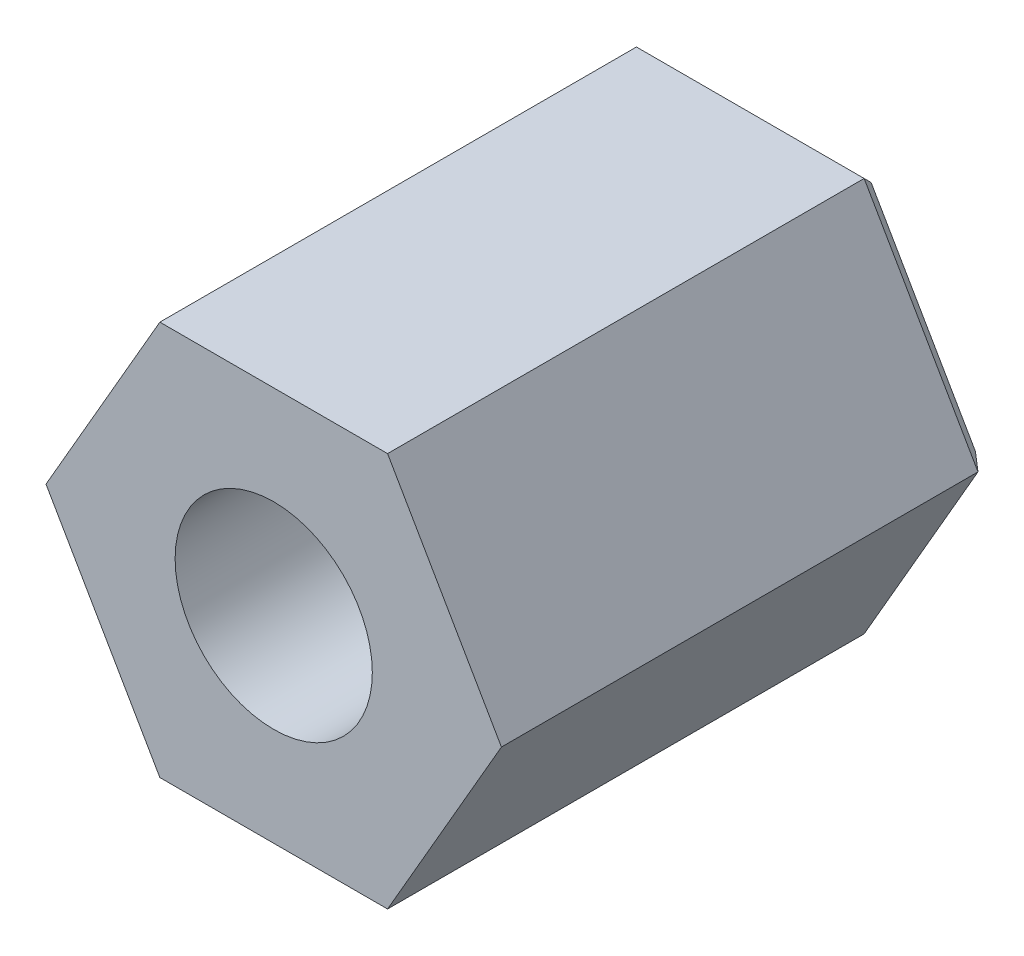
ISO-10303-21;
HEADER;
FILE_DESCRIPTION(('STEP AP214'),'2;1');
FILE_NAME('part.step','',(''),(''),'','','');
FILE_SCHEMA(('AUTOMOTIVE_DESIGN { 1 0 10303 214 1 1 1 1 }'));
ENDSEC;
DATA;
#1=APPLICATION_CONTEXT('core data for automotive mechanical design processes');
#2=APPLICATION_PROTOCOL_DEFINITION('international standard','automotive_design',2000,#1);
#3=PRODUCT_CONTEXT('',#1,'mechanical');
#4=PRODUCT('Part','Part','',(#3));
#5=PRODUCT_RELATED_PRODUCT_CATEGORY('part','',(#4));
#6=PRODUCT_DEFINITION_FORMATION('','',#4);
#7=PRODUCT_DEFINITION_CONTEXT('part definition',#1,'design');
#8=PRODUCT_DEFINITION('design','',#6,#7);
#9=PRODUCT_DEFINITION_SHAPE('','',#8);
#10=(LENGTH_UNIT() NAMED_UNIT(*) SI_UNIT(.MILLI.,.METRE.));
#11=(NAMED_UNIT(*) PLANE_ANGLE_UNIT() SI_UNIT($,.RADIAN.));
#12=(NAMED_UNIT(*) SI_UNIT($,.STERADIAN.) SOLID_ANGLE_UNIT());
#13=UNCERTAINTY_MEASURE_WITH_UNIT(LENGTH_MEASURE(1.E-05),#10,'distance_accuracy_value','');
#14=(GEOMETRIC_REPRESENTATION_CONTEXT(3) GLOBAL_UNCERTAINTY_ASSIGNED_CONTEXT((#13)) GLOBAL_UNIT_ASSIGNED_CONTEXT((#10,
#11,#12)) REPRESENTATION_CONTEXT('',''));
#15=CARTESIAN_POINT('',(0.,0.,0.));
#16=DIRECTION('',(0.,0.,1.));
#17=DIRECTION('',(1.,0.,0.));
#18=AXIS2_PLACEMENT_3D('',#15,#16,#17);
#19=CARTESIAN_POINT('',(3.46410161513775,-6.00000000000001,0.));
#20=DIRECTION('',(0.,0.,-1.));
#21=DIRECTION('',(-1.,0.,0.));
#22=AXIS2_PLACEMENT_3D('',#19,#20,#21);
#23=PLANE('',#22);
#24=CARTESIAN_POINT('',(0.,0.,0.));
#25=DIRECTION('',(0.,0.,-1.));
#26=DIRECTION('',(-1.,0.,0.));
#27=AXIS2_PLACEMENT_3D('',#24,#25,#26);
#28=CIRCLE('',#27,2.49999999999773);
#29=CARTESIAN_POINT('',(-2.49999999999773,0.,0.));
#30=VERTEX_POINT('',#29);
#31=EDGE_CURVE('E19',#30,#30,#28,.F.);
#32=ORIENTED_EDGE('',*,*,#31,.T.);
#33=EDGE_LOOP('',(#32));
#34=FACE_BOUND('',#33,.T.);
#35=DIRECTION('',(0.5,-0.866025403784439,0.));
#36=VECTOR('',#35,1.);
#37=CARTESIAN_POINT('',(-6.3508529610859,0.,0.));
#38=LINE('',#37,#36);
#39=CARTESIAN_POINT('',(-6.3508529610859,0.,0.));
#40=VERTEX_POINT('',#39);
#41=CARTESIAN_POINT('',(-3.17542648054295,-5.50000000000001,0.));
#42=VERTEX_POINT('',#41);
#43=EDGE_CURVE('E85',#40,#42,#38,.T.);
#44=ORIENTED_EDGE('',*,*,#43,.F.);
#45=DIRECTION('',(-0.5,-0.866025403784439,0.));
#46=VECTOR('',#45,1.);
#47=CARTESIAN_POINT('',(-3.17542648054295,5.50000000000001,0.));
#48=LINE('',#47,#46);
#49=CARTESIAN_POINT('',(-3.17542648054295,5.50000000000001,0.));
#50=VERTEX_POINT('',#49);
#51=EDGE_CURVE('E108',#50,#40,#48,.T.);
#52=ORIENTED_EDGE('',*,*,#51,.F.);
#53=DIRECTION('',(1.,0.,0.));
#54=VECTOR('',#53,1.);
#55=CARTESIAN_POINT('',(3.46410161513775,5.50000000000001,0.));
#56=LINE('',#55,#54);
#57=CARTESIAN_POINT('',(3.17542648054293,5.50000000000001,0.));
#58=VERTEX_POINT('',#57);
#59=EDGE_CURVE('E176',#58,#50,#56,.F.);
#60=ORIENTED_EDGE('',*,*,#59,.F.);
#61=DIRECTION('',(-0.5,0.866025403784438,0.));
#62=VECTOR('',#61,1.);
#63=CARTESIAN_POINT('',(6.35085296108588,0.,0.));
#64=LINE('',#63,#62);
#65=CARTESIAN_POINT('',(6.35085296108588,0.,0.));
#66=VERTEX_POINT('',#65);
#67=EDGE_CURVE('E174',#66,#58,#64,.T.);
#68=ORIENTED_EDGE('',*,*,#67,.F.);
#69=DIRECTION('',(0.5,0.866025403784439,0.));
#70=VECTOR('',#69,1.);
#71=CARTESIAN_POINT('',(3.17542648054294,-5.50000000000001,0.));
#72=LINE('',#71,#70);
#73=CARTESIAN_POINT('',(3.17542648054294,-5.50000000000001,0.));
#74=VERTEX_POINT('',#73);
#75=EDGE_CURVE('E99',#74,#66,#72,.T.);
#76=ORIENTED_EDGE('',*,*,#75,.F.);
#77=DIRECTION('',(1.,0.,0.));
#78=VECTOR('',#77,1.);
#79=CARTESIAN_POINT('',(-3.46410161513776,-5.50000000000001,0.));
#80=LINE('',#79,#78);
#81=EDGE_CURVE('E95',#42,#74,#80,.T.);
#82=ORIENTED_EDGE('',*,*,#81,.F.);
#83=EDGE_LOOP('',(#44,#52,#60,#68,#76,#82));
#84=FACE_BOUND('',#83,.T.);
#85=ADVANCED_FACE('F16',(#34,#84),#23,.T.);
#86=CARTESIAN_POINT('',(-3.46410161513776,-6.00000000000001,0.5));
#87=DIRECTION('',(0.,-0.707106781186546,-0.707106781186549));
#88=DIRECTION('',(0.,0.707106781186549,-0.707106781186546));
#89=AXIS2_PLACEMENT_3D('',#86,#87,#88);
#90=PLANE('',#89);
#91=DIRECTION('',(-0.377964473009228,0.654653670707978,-0.654653670707976));
#92=VECTOR('',#91,1.);
#93=CARTESIAN_POINT('',(3.46410161513775,-6.00000000000001,0.5));
#94=LINE('',#93,#92);
#95=CARTESIAN_POINT('',(3.46410161513775,-6.00000000000001,0.499999999999999));
#96=VERTEX_POINT('',#95);
#97=EDGE_CURVE('E170',#96,#74,#94,.T.);
#98=ORIENTED_EDGE('',*,*,#97,.F.);
#99=DIRECTION('',(-1.,0.,0.));
#100=VECTOR('',#99,1.);
#101=CARTESIAN_POINT('',(-3.46410161513776,-6.00000000000001,0.5));
#102=LINE('',#101,#100);
#103=CARTESIAN_POINT('',(-3.46410161513776,-6.00000000000001,0.500000000000001));
#104=VERTEX_POINT('',#103);
#105=EDGE_CURVE('E105',#96,#104,#102,.T.);
#106=ORIENTED_EDGE('',*,*,#105,.T.);
#107=DIRECTION('',(-0.377964473009228,-0.654653670707978,0.654653670707976));
#108=VECTOR('',#107,1.);
#109=CARTESIAN_POINT('',(-3.17542648054295,-5.50000000000001,0.));
#110=LINE('',#109,#108);
#111=EDGE_CURVE('E92',#42,#104,#110,.T.);
#112=ORIENTED_EDGE('',*,*,#111,.F.);
#113=ORIENTED_EDGE('',*,*,#81,.T.);
#114=EDGE_LOOP('',(#98,#106,#112,#113));
#115=FACE_BOUND('',#114,.T.);
#116=ADVANCED_FACE('F104',(#115),#90,.T.);
#117=CARTESIAN_POINT('',(-6.92820323027552,0.,0.5));
#118=DIRECTION('',(-0.612372435695793,-0.353553390593273,-0.707106781186549));
#119=DIRECTION('',(-0.755928946018456,0.,0.654653670707976));
#120=AXIS2_PLACEMENT_3D('',#117,#118,#119);
#121=PLANE('',#120);
#122=ORIENTED_EDGE('',*,*,#111,.T.);
#123=DIRECTION('',(-0.5,0.866025403784439,0.));
#124=VECTOR('',#123,1.);
#125=CARTESIAN_POINT('',(-6.92820323027552,0.,0.5));
#126=LINE('',#125,#124);
#127=CARTESIAN_POINT('',(-6.92820323027552,0.,0.5));
#128=VERTEX_POINT('',#127);
#129=EDGE_CURVE('E222',#104,#128,#126,.T.);
#130=ORIENTED_EDGE('',*,*,#129,.T.);
#131=DIRECTION('',(-0.755928946018456,0.,0.654653670707976));
#132=VECTOR('',#131,1.);
#133=CARTESIAN_POINT('',(-4.94871659305394,0.,-1.21428571428572));
#134=LINE('',#133,#132);
#135=EDGE_CURVE('E94',#40,#128,#134,.T.);
#136=ORIENTED_EDGE('',*,*,#135,.F.);
#137=ORIENTED_EDGE('',*,*,#43,.T.);
#138=EDGE_LOOP('',(#122,#130,#136,#137));
#139=FACE_BOUND('',#138,.T.);
#140=ADVANCED_FACE('F89',(#139),#121,.T.);
#141=CARTESIAN_POINT('',(-3.46410161513776,6.00000000000001,0.5));
#142=DIRECTION('',(-0.612372435695794,0.353553390593273,-0.707106781186549));
#143=DIRECTION('',(-0.755928946018456,0.,0.654653670707976));
#144=AXIS2_PLACEMENT_3D('',#141,#142,#143);
#145=PLANE('',#144);
#146=DIRECTION('',(-0.377964473009227,0.654653670707979,0.654653670707975));
#147=VECTOR('',#146,1.);
#148=CARTESIAN_POINT('',(-3.17542648054295,5.50000000000001,0.));
#149=LINE('',#148,#147);
#150=CARTESIAN_POINT('',(-3.46410161513776,6.00000000000001,0.499999999999998));
#151=VERTEX_POINT('',#150);
#152=EDGE_CURVE('E179',#50,#151,#149,.T.);
#153=ORIENTED_EDGE('',*,*,#152,.F.);
#154=ORIENTED_EDGE('',*,*,#51,.T.);
#155=ORIENTED_EDGE('',*,*,#135,.T.);
#156=DIRECTION('',(0.5,0.866025403784439,0.));
#157=VECTOR('',#156,1.);
#158=CARTESIAN_POINT('',(-3.46410161513776,6.00000000000001,0.499999999999994));
#159=LINE('',#158,#157);
#160=EDGE_CURVE('E217',#128,#151,#159,.T.);
#161=ORIENTED_EDGE('',*,*,#160,.T.);
#162=EDGE_LOOP('',(#153,#154,#155,#161));
#163=FACE_BOUND('',#162,.T.);
#164=ADVANCED_FACE('F182',(#163),#145,.T.);
#165=CARTESIAN_POINT('',(3.46410161513775,6.00000000000001,0.5));
#166=DIRECTION('',(0.,0.707106781186546,-0.707106781186549));
#167=DIRECTION('',(0.,0.707106781186549,0.707106781186546));
#168=AXIS2_PLACEMENT_3D('',#165,#166,#167);
#169=PLANE('',#168);
#170=DIRECTION('',(0.377964473009225,0.65465367070798,0.654653670707976));
#171=VECTOR('',#170,1.);
#172=CARTESIAN_POINT('',(3.17542648054293,5.50000000000001,0.));
#173=LINE('',#172,#171);
#174=CARTESIAN_POINT('',(3.46410161513775,6.00000000000001,0.5));
#175=VERTEX_POINT('',#174);
#176=EDGE_CURVE('E172',#58,#175,#173,.T.);
#177=ORIENTED_EDGE('',*,*,#176,.F.);
#178=ORIENTED_EDGE('',*,*,#59,.T.);
#179=ORIENTED_EDGE('',*,*,#152,.T.);
#180=DIRECTION('',(1.,0.,0.));
#181=VECTOR('',#180,1.);
#182=CARTESIAN_POINT('',(3.46410161513775,6.00000000000001,0.5));
#183=LINE('',#182,#181);
#184=EDGE_CURVE('E190',#151,#175,#183,.T.);
#185=ORIENTED_EDGE('',*,*,#184,.T.);
#186=EDGE_LOOP('',(#177,#178,#179,#185));
#187=FACE_BOUND('',#186,.T.);
#188=ADVANCED_FACE('F187',(#187),#169,.T.);
#189=CARTESIAN_POINT('',(6.92820323027551,0.,0.5));
#190=DIRECTION('',(0.612372435695794,0.353553390593274,-0.707106781186548));
#191=DIRECTION('',(-0.755928946018455,0.,-0.654653670707976));
#192=AXIS2_PLACEMENT_3D('',#189,#190,#191);
#193=PLANE('',#192);
#194=ORIENTED_EDGE('',*,*,#176,.T.);
#195=DIRECTION('',(0.5,-0.866025403784438,0.));
#196=VECTOR('',#195,1.);
#197=CARTESIAN_POINT('',(6.92820323027551,0.,0.5));
#198=LINE('',#197,#196);
#199=CARTESIAN_POINT('',(6.92820323027551,0.,0.5));
#200=VERTEX_POINT('',#199);
#201=EDGE_CURVE('E196',#175,#200,#198,.T.);
#202=ORIENTED_EDGE('',*,*,#201,.T.);
#203=DIRECTION('',(-0.755928946018456,0.,-0.654653670707976));
#204=VECTOR('',#203,1.);
#205=CARTESIAN_POINT('',(4.94871659305393,0.,-1.21428571428572));
#206=LINE('',#205,#204);
#207=EDGE_CURVE('E167',#66,#200,#206,.F.);
#208=ORIENTED_EDGE('',*,*,#207,.F.);
#209=ORIENTED_EDGE('',*,*,#67,.T.);
#210=EDGE_LOOP('',(#194,#202,#208,#209));
#211=FACE_BOUND('',#210,.T.);
#212=ADVANCED_FACE('F194',(#211),#193,.T.);
#213=CARTESIAN_POINT('',(3.46410161513775,-6.00000000000001,0.5));
#214=DIRECTION('',(0.612372435695793,-0.353553390593273,-0.707106781186549));
#215=DIRECTION('',(-0.755928946018456,0.,-0.654653670707976));
#216=AXIS2_PLACEMENT_3D('',#213,#214,#215);
#217=PLANE('',#216);
#218=ORIENTED_EDGE('',*,*,#207,.T.);
#219=DIRECTION('',(-0.5,-0.866025403784439,0.));
#220=VECTOR('',#219,1.);
#221=CARTESIAN_POINT('',(3.46410161513775,-6.00000000000001,0.499999999999994));
#222=LINE('',#221,#220);
#223=EDGE_CURVE('E200',#200,#96,#222,.T.);
#224=ORIENTED_EDGE('',*,*,#223,.T.);
#225=ORIENTED_EDGE('',*,*,#97,.T.);
#226=ORIENTED_EDGE('',*,*,#75,.T.);
#227=EDGE_LOOP('',(#218,#224,#225,#226));
#228=FACE_BOUND('',#227,.T.);
#229=ADVANCED_FACE('F199',(#228),#217,.T.);
#230=CARTESIAN_POINT('',(0.,0.,0.));
#231=DIRECTION('',(0.,0.,-1.));
#232=DIRECTION('',(-1.,0.,0.));
#233=AXIS2_PLACEMENT_3D('',#230,#231,#232);
#234=CONICAL_SURFACE('',#233,2.49999999999773,0.785398163454292);
#235=CARTESIAN_POINT('',(0.,0.,0.500000000000006));
#236=DIRECTION('',(0.,0.,-1.));
#237=DIRECTION('',(-1.,0.,0.));
#238=AXIS2_PLACEMENT_3D('',#235,#236,#237);
#239=CIRCLE('',#238,2.);
#240=CARTESIAN_POINT('',(-2.,0.,0.500000000000006));
#241=VERTEX_POINT('',#240);
#242=EDGE_CURVE('E155',#241,#241,#239,.F.);
#243=ORIENTED_EDGE('',*,*,#242,.T.);
#244=EDGE_LOOP('',(#243));
#245=FACE_BOUND('',#244,.T.);
#246=ORIENTED_EDGE('',*,*,#31,.F.);
#247=EDGE_LOOP('',(#246));
#248=FACE_BOUND('',#247,.T.);
#249=ADVANCED_FACE('F229',(#245,#248),#234,.F.);
#250=CARTESIAN_POINT('',(-3.46410161513776,-6.00000000000001,15.));
#251=DIRECTION('',(0.,1.,0.));
#252=DIRECTION('',(-1.,0.,0.));
#253=AXIS2_PLACEMENT_3D('',#250,#251,#252);
#254=PLANE('',#253);
#255=ORIENTED_EDGE('',*,*,#105,.F.);
#256=DIRECTION('',(0.,0.,1.));
#257=VECTOR('',#256,1.);
#258=CARTESIAN_POINT('',(3.46410161513775,-6.00000000000001,15.));
#259=LINE('',#258,#257);
#260=CARTESIAN_POINT('',(3.46410161513775,-6.00000000000001,15.));
#261=VERTEX_POINT('',#260);
#262=EDGE_CURVE('E163',#96,#261,#259,.T.);
#263=ORIENTED_EDGE('',*,*,#262,.T.);
#264=DIRECTION('',(-1.,0.,0.));
#265=VECTOR('',#264,1.);
#266=CARTESIAN_POINT('',(3.46410161513775,-6.00000000000001,15.));
#267=LINE('',#266,#265);
#268=CARTESIAN_POINT('',(-3.46410161513776,-6.00000000000001,15.));
#269=VERTEX_POINT('',#268);
#270=EDGE_CURVE('E157',#261,#269,#267,.T.);
#271=ORIENTED_EDGE('',*,*,#270,.T.);
#272=DIRECTION('',(0.,0.,1.));
#273=VECTOR('',#272,1.);
#274=CARTESIAN_POINT('',(-3.46410161513776,-6.00000000000001,15.));
#275=LINE('',#274,#273);
#276=EDGE_CURVE('E223',#269,#104,#275,.F.);
#277=ORIENTED_EDGE('',*,*,#276,.T.);
#278=EDGE_LOOP('',(#255,#263,#271,#277));
#279=FACE_BOUND('',#278,.T.);
#280=ADVANCED_FACE('F231',(#279),#254,.F.);
#281=CARTESIAN_POINT('',(-6.92820323027552,0.,15.));
#282=DIRECTION('',(0.866025403784439,0.5,0.));
#283=DIRECTION('',(-0.5,0.866025403784439,0.));
#284=AXIS2_PLACEMENT_3D('',#281,#282,#283);
#285=PLANE('',#284);
#286=ORIENTED_EDGE('',*,*,#129,.F.);
#287=ORIENTED_EDGE('',*,*,#276,.F.);
#288=DIRECTION('',(-0.5,0.866025403784439,0.));
#289=VECTOR('',#288,1.);
#290=CARTESIAN_POINT('',(-3.46410161513776,-6.00000000000001,15.));
#291=LINE('',#290,#289);
#292=CARTESIAN_POINT('',(-6.92820323027552,0.,15.));
#293=VERTEX_POINT('',#292);
#294=EDGE_CURVE('E160',#269,#293,#291,.T.);
#295=ORIENTED_EDGE('',*,*,#294,.T.);
#296=DIRECTION('',(0.,0.,1.));
#297=VECTOR('',#296,1.);
#298=CARTESIAN_POINT('',(-6.92820323027552,0.,15.));
#299=LINE('',#298,#297);
#300=EDGE_CURVE('E219',#293,#128,#299,.F.);
#301=ORIENTED_EDGE('',*,*,#300,.T.);
#302=EDGE_LOOP('',(#286,#287,#295,#301));
#303=FACE_BOUND('',#302,.T.);
#304=ADVANCED_FACE('F237',(#303),#285,.F.);
#305=CARTESIAN_POINT('',(-3.46410161513776,6.00000000000001,15.));
#306=DIRECTION('',(0.866025403784439,-0.5,0.));
#307=DIRECTION('',(0.5,0.866025403784439,0.));
#308=AXIS2_PLACEMENT_3D('',#305,#306,#307);
#309=PLANE('',#308);
#310=ORIENTED_EDGE('',*,*,#160,.F.);
#311=ORIENTED_EDGE('',*,*,#300,.F.);
#312=DIRECTION('',(0.5,0.866025403784439,0.));
#313=VECTOR('',#312,1.);
#314=CARTESIAN_POINT('',(-6.92820323027552,0.,15.));
#315=LINE('',#314,#313);
#316=CARTESIAN_POINT('',(-3.46410161513776,6.00000000000001,15.));
#317=VERTEX_POINT('',#316);
#318=EDGE_CURVE('E396',#293,#317,#315,.T.);
#319=ORIENTED_EDGE('',*,*,#318,.T.);
#320=DIRECTION('',(0.,0.,-1.));
#321=VECTOR('',#320,1.);
#322=CARTESIAN_POINT('',(-3.46410161513776,6.00000000000001,15.));
#323=LINE('',#322,#321);
#324=EDGE_CURVE('E214',#317,#151,#323,.T.);
#325=ORIENTED_EDGE('',*,*,#324,.T.);
#326=EDGE_LOOP('',(#310,#311,#319,#325));
#327=FACE_BOUND('',#326,.T.);
#328=CARTESIAN_POINT('',(-5.19615242270665,3.00000000000001,6.));
#329=DIRECTION('',(-0.866025403784439,0.5,0.));
#330=DIRECTION('',(-0.5,-0.866025403784439,0.));
#331=AXIS2_PLACEMENT_3D('',#328,#329,#330);
#332=CIRCLE('',#331,1.5);
#333=CARTESIAN_POINT('',(-5.94615242270665,1.70096189432335,6.));
#334=VERTEX_POINT('',#333);
#335=EDGE_CURVE('E125',#334,#334,#332,.F.);
#336=ORIENTED_EDGE('',*,*,#335,.T.);
#337=EDGE_LOOP('',(#336));
#338=FACE_BOUND('',#337,.T.);
#339=ADVANCED_FACE('F318',(#327,#338),#309,.F.);
#340=CARTESIAN_POINT('',(3.46410161513775,6.00000000000001,15.));
#341=DIRECTION('',(0.,-1.,0.));
#342=DIRECTION('',(0.,0.,-1.));
#343=AXIS2_PLACEMENT_3D('',#340,#341,#342);
#344=PLANE('',#343);
#345=ORIENTED_EDGE('',*,*,#184,.F.);
#346=ORIENTED_EDGE('',*,*,#324,.F.);
#347=DIRECTION('',(-1.,0.,0.));
#348=VECTOR('',#347,1.);
#349=CARTESIAN_POINT('',(3.46410161513775,6.00000000000002,15.));
#350=LINE('',#349,#348);
#351=CARTESIAN_POINT('',(3.46410161513775,6.00000000000001,15.));
#352=VERTEX_POINT('',#351);
#353=EDGE_CURVE('E392',#317,#352,#350,.F.);
#354=ORIENTED_EDGE('',*,*,#353,.T.);
#355=DIRECTION('',(0.,0.,1.));
#356=VECTOR('',#355,1.);
#357=CARTESIAN_POINT('',(3.46410161513774,6.00000000000001,15.));
#358=LINE('',#357,#356);
#359=EDGE_CURVE('E210',#352,#175,#358,.F.);
#360=ORIENTED_EDGE('',*,*,#359,.T.);
#361=EDGE_LOOP('',(#345,#346,#354,#360));
#362=FACE_BOUND('',#361,.T.);
#363=ADVANCED_FACE('F327',(#362),#344,.F.);
#364=CARTESIAN_POINT('',(6.92820323027551,0.,15.));
#365=DIRECTION('',(-0.866025403784438,-0.5,0.));
#366=DIRECTION('',(0.5,-0.866025403784438,0.));
#367=AXIS2_PLACEMENT_3D('',#364,#365,#366);
#368=PLANE('',#367);
#369=ORIENTED_EDGE('',*,*,#201,.F.);
#370=ORIENTED_EDGE('',*,*,#359,.F.);
#371=DIRECTION('',(0.5,-0.866025403784438,0.));
#372=VECTOR('',#371,1.);
#373=CARTESIAN_POINT('',(3.46410161513775,6.00000000000002,15.));
#374=LINE('',#373,#372);
#375=CARTESIAN_POINT('',(6.92820323027551,0.,15.));
#376=VERTEX_POINT('',#375);
#377=EDGE_CURVE('E395',#352,#376,#374,.T.);
#378=ORIENTED_EDGE('',*,*,#377,.T.);
#379=DIRECTION('',(0.,0.,1.));
#380=VECTOR('',#379,1.);
#381=CARTESIAN_POINT('',(6.92820323027551,0.,15.));
#382=LINE('',#381,#380);
#383=EDGE_CURVE('E34',#376,#200,#382,.F.);
#384=ORIENTED_EDGE('',*,*,#383,.T.);
#385=EDGE_LOOP('',(#369,#370,#378,#384));
#386=FACE_BOUND('',#385,.T.);
#387=ADVANCED_FACE('F337',(#386),#368,.F.);
#388=CARTESIAN_POINT('',(3.46410161513775,-6.00000000000001,15.));
#389=DIRECTION('',(-0.866025403784439,0.5,0.));
#390=DIRECTION('',(-0.5,-0.866025403784439,0.));
#391=AXIS2_PLACEMENT_3D('',#388,#389,#390);
#392=PLANE('',#391);
#393=ORIENTED_EDGE('',*,*,#223,.F.);
#394=ORIENTED_EDGE('',*,*,#383,.F.);
#395=DIRECTION('',(-0.5,-0.866025403784439,0.));
#396=VECTOR('',#395,1.);
#397=CARTESIAN_POINT('',(6.92820323027551,0.,15.));
#398=LINE('',#397,#396);
#399=EDGE_CURVE('E124',#376,#261,#398,.T.);
#400=ORIENTED_EDGE('',*,*,#399,.T.);
#401=ORIENTED_EDGE('',*,*,#262,.F.);
#402=EDGE_LOOP('',(#393,#394,#400,#401));
#403=FACE_BOUND('',#402,.T.);
#404=ADVANCED_FACE('F149',(#403),#392,.F.);
#405=CARTESIAN_POINT('',(0.,0.,6.));
#406=DIRECTION('',(-0.866025403784439,0.5,0.));
#407=DIRECTION('',(-0.5,-0.866025403784439,0.));
#408=AXIS2_PLACEMENT_3D('',#405,#406,#407);
#409=CYLINDRICAL_SURFACE('',#408,1.5);
#410=CARTESIAN_POINT('',(-1.5,2.59807621135332,6.));
#411=CARTESIAN_POINT('',(-1.50000736907311,2.59807516061262,6.07822593596948));
#412=CARTESIAN_POINT('',(-1.50618117762352,2.59453752020173,6.15649796806455));
#413=CARTESIAN_POINT('',(-1.53025693029932,2.5804063043293,6.31059829635993));
#414=CARTESIAN_POINT('',(-1.54817341464831,2.56980398083941,6.38642344043881));
#415=CARTESIAN_POINT('',(-1.59396418125756,2.54165094120173,6.53317276451657));
#416=CARTESIAN_POINT('',(-1.62178889130733,2.52413476950191,6.6041192817077));
#417=CARTESIAN_POINT('',(-1.68536551686751,2.48213427329621,6.74012356610808));
#418=CARTESIAN_POINT('',(-1.72111933792512,2.45764827337906,6.80517991247268));
#419=CARTESIAN_POINT('',(-1.80169027265116,2.39928771834709,6.93345994880613));
#420=CARTESIAN_POINT('',(-1.84701142929048,2.364805821408,6.99609096029848));
#421=CARTESIAN_POINT('',(-1.94208523524274,2.28737070892969,7.11211441557761));
#422=CARTESIAN_POINT('',(-1.99183992211687,2.24441358722209,7.16550257802119));
#423=CARTESIAN_POINT('',(-2.096859127732,2.14677769428467,7.26505066046027));
#424=CARTESIAN_POINT('',(-2.15226895631906,2.09150388317091,7.31048051552693));
#425=CARTESIAN_POINT('',(-2.26255320420145,1.9716654849211,7.38771117846174));
#426=CARTESIAN_POINT('',(-2.3174279385169,1.90710676697032,7.41952054598338));
#427=CARTESIAN_POINT('',(-2.4199991843152,1.77485225872997,7.466256954714));
#428=CARTESIAN_POINT('',(-2.46792862807209,1.70770657958125,7.48222423578925));
#429=CARTESIAN_POINT('',(-2.55874661019408,1.56834837527528,7.50024917016289));
#430=CARTESIAN_POINT('',(-2.60163816625428,1.4961389251476,7.50231519249675));
#431=CARTESIAN_POINT('',(-2.67737171844855,1.35554560174412,7.49287998146216));
#432=CARTESIAN_POINT('',(-2.71076327798687,1.28737511190643,7.48254294046451));
#433=CARTESIAN_POINT('',(-2.77144247133596,1.15094810757322,7.45067864865459));
#434=CARTESIAN_POINT('',(-2.79872967143314,1.0826915873115,7.42915060308451));
#435=CARTESIAN_POINT('',(-2.84747778051418,0.947171104150869,7.37537594891822));
#436=CARTESIAN_POINT('',(-2.86885279130447,0.879933968063741,7.34298506428883));
#437=CARTESIAN_POINT('',(-2.90571831733054,0.749277042478965,7.26860415810876));
#438=CARTESIAN_POINT('',(-2.92120681414999,0.685858568617126,7.22661085189166));
#439=CARTESIAN_POINT('',(-2.94828961634389,0.558748132651434,7.1296616750453));
#440=CARTESIAN_POINT('',(-2.95937802130257,0.495595953181213,7.07385616010151));
#441=CARTESIAN_POINT('',(-2.97670939502514,0.377826166623014,6.9531262090634));
#442=CARTESIAN_POINT('',(-2.98294778246146,0.323216667744126,6.88819321933783));
#443=CARTESIAN_POINT('',(-2.99227281060953,0.221530094753806,6.74598787458372));
#444=CARTESIAN_POINT('',(-2.99513206278985,0.175159233356,6.66819163902166));
#445=CARTESIAN_POINT('',(-2.99867535595296,0.0973706458892143,6.50548171319753));
#446=CARTESIAN_POINT('',(-2.99936420089364,0.0659200268596455,6.42058416941497));
#447=CARTESIAN_POINT('',(-2.9998925109097,0.0289582165777979,6.27908270628065));
#448=CARTESIAN_POINT('',(-2.99995382558698,0.0181410726933969,6.22382882124362));
#449=CARTESIAN_POINT('',(-3.00000656725644,0.00366010457712913,6.11239111476087));
#450=CARTESIAN_POINT('',(-2.99999800639733,-4.96299248100824E-06,6.05620745666254));
#451=CARTESIAN_POINT('',(-3.00000277456842,6.9071748663551E-06,5.92177406403052));
#452=CARTESIAN_POINT('',(-3.00002599237834,0.00712240242306567,5.84350203193545));
#453=CARTESIAN_POINT('',(-2.99982587678435,0.0350382237917548,5.68940170364007));
#454=CARTESIAN_POINT('',(-2.99960223747746,0.0558555161294346,5.61357655956119));
#455=CARTESIAN_POINT('',(-2.9981163732621,0.109588003090647,5.46682723548343));
#456=CARTESIAN_POINT('',(-2.99685927861789,0.142442994696597,5.3958807182923));
#457=CARTESIAN_POINT('',(-2.9922740947123,0.218502215621446,5.25987643389192));
#458=CARTESIAN_POINT('',(-2.98894550727578,0.261708932898278,5.19482008752732));
#459=CARTESIAN_POINT('',(-2.97868925140216,0.360665686693673,5.06654005119387));
#460=CARTESIAN_POINT('',(-2.97148763100189,0.417155908141767,5.00390903970152));
#461=CARTESIAN_POINT('',(-2.9519637594269,0.538209795570045,4.88788558442239));
#462=CARTESIAN_POINT('',(-2.93963914419173,0.602777179214188,4.83449742197881));
#463=CARTESIAN_POINT('',(-2.90759358339431,0.742544425630862,4.73494933953972));
#464=CARTESIAN_POINT('',(-2.88742997309934,0.818167650363477,4.68951948447306));
#465=CARTESIAN_POINT('',(-2.83878899980736,0.973595809791793,4.61228882153826));
#466=CARTESIAN_POINT('',(-2.81031687718396,1.05339808271028,4.58047945401662));
#467=CARTESIAN_POINT('',(-2.74706673618194,1.2083546413896,4.533743045286));
#468=CARTESIAN_POINT('',(-2.71288159416324,1.28343559684668,4.51777576421075));
#469=CARTESIAN_POINT('',(-2.63760284006948,1.43176537863775,4.49975082983711));
#470=CARTESIAN_POINT('',(-2.5965133998957,1.50501528085757,4.49768480750325));
#471=CARTESIAN_POINT('',(-2.51262278632294,1.64089912267839,4.50712001853784));
#472=CARTESIAN_POINT('',(-2.47028119010424,1.7039023064294,4.51745705953549));
#473=CARTESIAN_POINT('',(-2.38247153526401,1.82466553151746,4.54932135134541));
#474=CARTESIAN_POINT('',(-2.33700325479203,1.88242520013062,4.57084939691549));
#475=CARTESIAN_POINT('',(-2.2440131281823,1.99240254256158,4.62462405108178));
#476=CARTESIAN_POINT('',(-2.19647156564828,2.0445324129557,4.65701493571117));
#477=CARTESIAN_POINT('',(-2.10175211192453,2.14178735781054,4.73139584189124));
#478=CARTESIAN_POINT('',(-2.05457435090066,2.18691002645354,4.77338914810834));
#479=CARTESIAN_POINT('',(-1.9580348853652,2.27391963914197,4.8703383249547));
#480=CARTESIAN_POINT('',(-1.90888769611898,2.31509856925875,4.92614383989849));
#481=CARTESIAN_POINT('',(-1.81556175602259,2.38899287246407,5.0468737909366));
#482=CARTESIAN_POINT('',(-1.77138773642369,2.42170022390202,5.11180678066217));
#483=CARTESIAN_POINT('',(-1.68798709506434,2.48061922166442,5.25401212541628));
#484=CARTESIAN_POINT('',(-1.64925837718862,2.5062808373873,5.33180836097834));
#485=CARTESIAN_POINT('',(-1.58366313089944,2.548243713013,5.49451828680247));
#486=CARTESIAN_POINT('',(-1.55677051832543,2.56456557974569,5.57941583058503));
#487=CARTESIAN_POINT('',(-1.52502480665951,2.58350401478159,5.72091729371935));
#488=CARTESIAN_POINT('',(-1.51568754259787,2.58896568679193,5.77617117875638));
#489=CARTESIAN_POINT('',(-1.50317302717252,2.59625184647566,5.88760888523913));
#490=CARTESIAN_POINT('',(-1.4999947051211,2.598076966339,5.94379254333746));
#491=CARTESIAN_POINT('',(-1.5,2.59807621135332,6.));
#492=B_SPLINE_CURVE_WITH_KNOTS('',3,(#410,#411,#412,#413,#414,#415,#416,#417,#418,#419,#420,
#421,#422,#423,#424,#425,#426,#427,#428,#429,#430,#431,#432,#433,#434,#435,#436,#437,#438,#439,
#440,#441,#442,#443,#444,#445,#446,#447,#448,#449,#450,#451,#452,#453,#454,#455,#456,#457,#458,
#459,#460,#461,#462,#463,#464,#465,#466,#467,#468,#469,#470,#471,#472,#473,#474,#475,#476,#477,
#478,#479,#480,#481,#482,#483,#484,#485,#486,#487,#488,#489,#490,#491),.UNSPECIFIED.,.T.,.F.,(4,
2,2,2,2,2,2,2,2,2,2,2,2,2,2,2,2,2,2,2,2,2,2,2,2,2,2,2,2,2,2,2,2,2,2,2,2,2,2,2,4),(0.,
0.234449231901202,0.469189317529191,0.702771096664711,0.936409071807235,1.18929789692147,
1.44230355005482,1.71236795365522,1.98226238811295,2.23295183209192,2.48349033889635,
2.71224188129933,2.94100967129787,3.17294484424673,3.40495947343859,3.65888530601411,
3.91305070653473,4.18349069032564,4.45333166290755,4.62181908778861,4.79027721971553,
5.02472645161674,5.25946653724472,5.49304831638025,5.72668629152277,5.97957511663701,
6.23258076977035,6.50264517337076,6.77253960782848,7.02322905180746,7.27376755861189,
7.50251910101486,7.73128689101341,7.96322206396226,8.19523669315413,8.44916252572965,
8.70332792625027,8.97376791004118,9.24360888262308,9.41209630750414,9.58055443943107),.UNSPECIFIED.);
#493=CARTESIAN_POINT('',(-1.5,2.59807621135332,6.));
#494=VERTEX_POINT('',#493);
#495=EDGE_CURVE('E117',#494,#494,#492,.T.);
#496=ORIENTED_EDGE('',*,*,#495,.T.);
#497=EDGE_LOOP('',(#496));
#498=FACE_BOUND('',#497,.T.);
#499=ORIENTED_EDGE('',*,*,#335,.F.);
#500=EDGE_LOOP('',(#499));
#501=FACE_BOUND('',#500,.T.);
#502=ADVANCED_FACE('F126',(#498,#501),#409,.F.);
#503=CARTESIAN_POINT('',(0.,0.,15.));
#504=DIRECTION('',(0.,0.,-1.));
#505=DIRECTION('',(-1.,0.,0.));
#506=AXIS2_PLACEMENT_3D('',#503,#504,#505);
#507=CYLINDRICAL_SURFACE('',#506,2.);
#508=CARTESIAN_POINT('',(0.,0.,4.));
#509=DIRECTION('',(0.,0.,-1.));
#510=DIRECTION('',(-1.,0.,0.));
#511=AXIS2_PLACEMENT_3D('',#508,#509,#510);
#512=CIRCLE('',#511,2.);
#513=CARTESIAN_POINT('',(-2.,0.,4.));
#514=VERTEX_POINT('',#513);
#515=EDGE_CURVE('E114',#514,#514,#512,.F.);
#516=ORIENTED_EDGE('',*,*,#515,.T.);
#517=EDGE_LOOP('',(#516));
#518=FACE_BOUND('',#517,.T.);
#519=ORIENTED_EDGE('',*,*,#242,.F.);
#520=EDGE_LOOP('',(#519));
#521=FACE_BOUND('',#520,.T.);
#522=ADVANCED_FACE('F141',(#518,#521),#507,.F.);
#523=CARTESIAN_POINT('',(3.46410161513775,-6.00000000000001,15.));
#524=DIRECTION('',(0.,0.,-1.));
#525=DIRECTION('',(-1.,0.,0.));
#526=AXIS2_PLACEMENT_3D('',#523,#524,#525);
#527=PLANE('',#526);
#528=ORIENTED_EDGE('',*,*,#377,.F.);
#529=ORIENTED_EDGE('',*,*,#353,.F.);
#530=ORIENTED_EDGE('',*,*,#318,.F.);
#531=ORIENTED_EDGE('',*,*,#294,.F.);
#532=ORIENTED_EDGE('',*,*,#270,.F.);
#533=ORIENTED_EDGE('',*,*,#399,.F.);
#534=EDGE_LOOP('',(#528,#529,#530,#531,#532,#533));
#535=FACE_BOUND('',#534,.T.);
#536=CARTESIAN_POINT('',(0.,0.,15.));
#537=DIRECTION('',(0.,0.,1.));
#538=DIRECTION('',(1.,0.,0.));
#539=AXIS2_PLACEMENT_3D('',#536,#537,#538);
#540=CIRCLE('',#539,3.);
#541=CARTESIAN_POINT('',(3.,0.,15.));
#542=VERTEX_POINT('',#541);
#543=EDGE_CURVE('E25',#542,#542,#540,.F.);
#544=ORIENTED_EDGE('',*,*,#543,.T.);
#545=EDGE_LOOP('',(#544));
#546=FACE_BOUND('',#545,.T.);
#547=ADVANCED_FACE('F138',(#535,#546),#527,.F.);
#548=CARTESIAN_POINT('',(0.,0.,4.));
#549=DIRECTION('',(0.,0.,-1.));
#550=DIRECTION('',(-1.,0.,0.));
#551=AXIS2_PLACEMENT_3D('',#548,#549,#550);
#552=PLANE('',#551);
#553=CARTESIAN_POINT('',(0.,0.,4.));
#554=DIRECTION('',(0.,0.,1.));
#555=DIRECTION('',(1.,0.,0.));
#556=AXIS2_PLACEMENT_3D('',#553,#554,#555);
#557=CIRCLE('',#556,3.);
#558=CARTESIAN_POINT('',(3.,0.,4.));
#559=VERTEX_POINT('',#558);
#560=EDGE_CURVE('E11',#559,#559,#557,.T.);
#561=ORIENTED_EDGE('',*,*,#560,.T.);
#562=EDGE_LOOP('',(#561));
#563=FACE_BOUND('',#562,.T.);
#564=ORIENTED_EDGE('',*,*,#515,.F.);
#565=EDGE_LOOP('',(#564));
#566=FACE_BOUND('',#565,.T.);
#567=ADVANCED_FACE('F134',(#563,#566),#552,.F.);
#568=CARTESIAN_POINT('',(0.,0.,0.));
#569=DIRECTION('',(0.,0.,1.));
#570=DIRECTION('',(1.,0.,0.));
#571=AXIS2_PLACEMENT_3D('',#568,#569,#570);
#572=CYLINDRICAL_SURFACE('',#571,3.);
#573=ORIENTED_EDGE('',*,*,#543,.F.);
#574=EDGE_LOOP('',(#573));
#575=FACE_BOUND('',#574,.T.);
#576=ORIENTED_EDGE('',*,*,#495,.F.);
#577=EDGE_LOOP('',(#576));
#578=FACE_BOUND('',#577,.T.);
#579=ORIENTED_EDGE('',*,*,#560,.F.);
#580=EDGE_LOOP('',(#579));
#581=FACE_BOUND('',#580,.T.);
#582=ADVANCED_FACE('F130',(#575,#578,#581),#572,.F.);
#583=CLOSED_SHELL('',(#85,#116,#140,#164,#188,#212,#229,#249,#280,#304,#339,#363,#387,#404,#502,
#522,#547,#567,#582));
#584=MANIFOLD_SOLID_BREP('B1',#583);
#585=ADVANCED_BREP_SHAPE_REPRESENTATION('',(#18,#584),#14);
#586=SHAPE_DEFINITION_REPRESENTATION(#9,#585);
ENDSEC;
END-ISO-10303-21;
